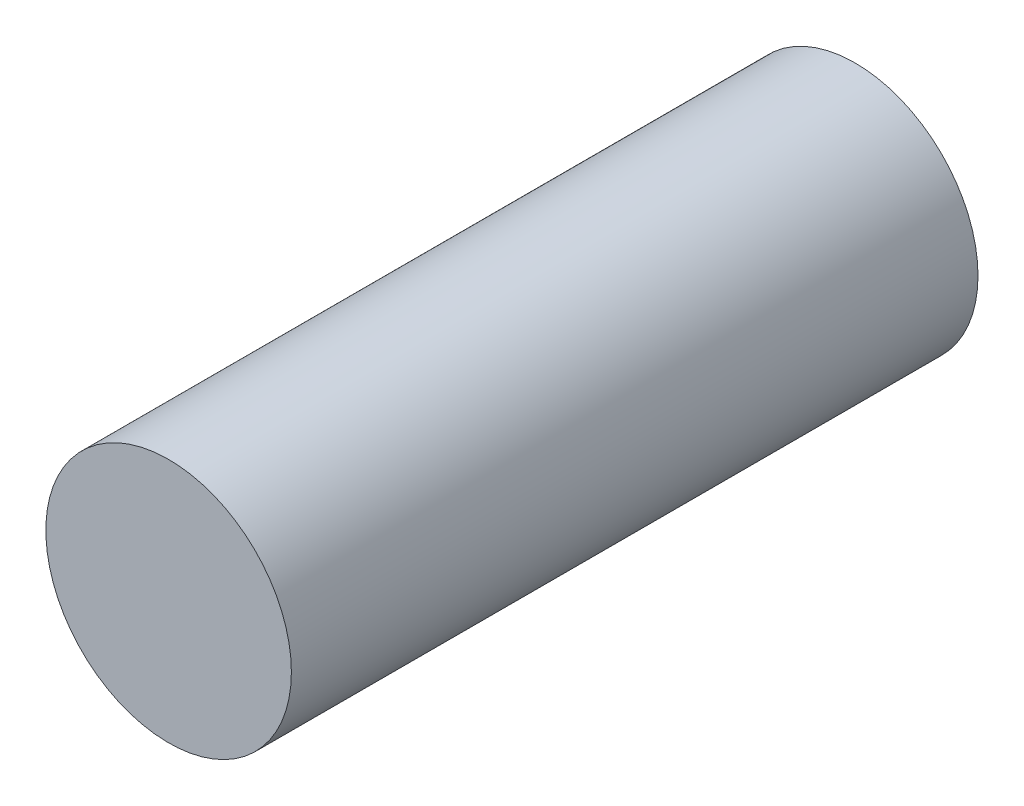
ISO-10303-21;
HEADER;
FILE_DESCRIPTION(('STEP AP214'),'2;1');
FILE_NAME('part.step','',(''),(''),'','','');
FILE_SCHEMA(('AUTOMOTIVE_DESIGN { 1 0 10303 214 1 1 1 1 }'));
ENDSEC;
DATA;
#1=APPLICATION_CONTEXT('core data for automotive mechanical design processes');
#2=APPLICATION_PROTOCOL_DEFINITION('international standard','automotive_design',2000,#1);
#3=PRODUCT_CONTEXT('',#1,'mechanical');
#4=PRODUCT('Part','Part','',(#3));
#5=PRODUCT_RELATED_PRODUCT_CATEGORY('part','',(#4));
#6=PRODUCT_DEFINITION_FORMATION('','',#4);
#7=PRODUCT_DEFINITION_CONTEXT('part definition',#1,'design');
#8=PRODUCT_DEFINITION('design','',#6,#7);
#9=PRODUCT_DEFINITION_SHAPE('','',#8);
#10=(LENGTH_UNIT() NAMED_UNIT(*) SI_UNIT(.MILLI.,.METRE.));
#11=(NAMED_UNIT(*) PLANE_ANGLE_UNIT() SI_UNIT($,.RADIAN.));
#12=(NAMED_UNIT(*) SI_UNIT($,.STERADIAN.) SOLID_ANGLE_UNIT());
#13=UNCERTAINTY_MEASURE_WITH_UNIT(LENGTH_MEASURE(1.E-05),#10,'distance_accuracy_value','');
#14=(GEOMETRIC_REPRESENTATION_CONTEXT(3) GLOBAL_UNCERTAINTY_ASSIGNED_CONTEXT((#13)) GLOBAL_UNIT_ASSIGNED_CONTEXT((#10,
#11,#12)) REPRESENTATION_CONTEXT('',''));
#15=CARTESIAN_POINT('',(0.,0.,0.));
#16=DIRECTION('',(0.,0.,1.));
#17=DIRECTION('',(1.,0.,0.));
#18=AXIS2_PLACEMENT_3D('',#15,#16,#17);
#19=CARTESIAN_POINT('',(0.,0.,609.6));
#20=DIRECTION('',(0.,0.,1.));
#21=DIRECTION('',(1.,0.,0.));
#22=AXIS2_PLACEMENT_3D('',#19,#20,#21);
#23=PLANE('',#22);
#24=CARTESIAN_POINT('',(0.,0.,609.6));
#25=DIRECTION('',(0.,0.,1.));
#26=DIRECTION('',(1.,0.,0.));
#27=AXIS2_PLACEMENT_3D('',#24,#25,#26);
#28=CIRCLE('',#27,109.);
#29=CARTESIAN_POINT('',(109.,0.,609.6));
#30=VERTEX_POINT('',#29);
#31=EDGE_CURVE('E10',#30,#30,#28,.T.);
#32=ORIENTED_EDGE('',*,*,#31,.T.);
#33=EDGE_LOOP('',(#32));
#34=FACE_BOUND('',#33,.T.);
#35=ADVANCED_FACE('F37',(#34),#23,.T.);
#36=CARTESIAN_POINT('',(0.,0.,0.));
#37=DIRECTION('',(0.,0.,1.));
#38=DIRECTION('',(1.,0.,0.));
#39=AXIS2_PLACEMENT_3D('',#36,#37,#38);
#40=PLANE('',#39);
#41=CARTESIAN_POINT('',(0.,0.,0.));
#42=DIRECTION('',(0.,0.,1.));
#43=DIRECTION('',(1.,0.,0.));
#44=AXIS2_PLACEMENT_3D('',#41,#42,#43);
#45=CIRCLE('',#44,109.);
#46=CARTESIAN_POINT('',(109.,0.,0.));
#47=VERTEX_POINT('',#46);
#48=EDGE_CURVE('E41',#47,#47,#45,.T.);
#49=ORIENTED_EDGE('',*,*,#48,.F.);
#50=EDGE_LOOP('',(#49));
#51=FACE_BOUND('',#50,.T.);
#52=ADVANCED_FACE('F53',(#51),#40,.F.);
#53=CARTESIAN_POINT('',(0.,0.,609.6));
#54=DIRECTION('',(0.,0.,-1.));
#55=DIRECTION('',(-1.,0.,0.));
#56=AXIS2_PLACEMENT_3D('',#53,#54,#55);
#57=CYLINDRICAL_SURFACE('',#56,109.);
#58=ORIENTED_EDGE('',*,*,#31,.F.);
#59=EDGE_LOOP('',(#58));
#60=FACE_BOUND('',#59,.T.);
#61=ORIENTED_EDGE('',*,*,#48,.T.);
#62=EDGE_LOOP('',(#61));
#63=FACE_BOUND('',#62,.T.);
#64=ADVANCED_FACE('F39',(#60,#63),#57,.T.);
#65=CLOSED_SHELL('',(#35,#52,#64));
#66=MANIFOLD_SOLID_BREP('B2',#65);
#67=ADVANCED_BREP_SHAPE_REPRESENTATION('',(#18,#66),#14);
#68=SHAPE_DEFINITION_REPRESENTATION(#9,#67);
ENDSEC;
END-ISO-10303-21;
